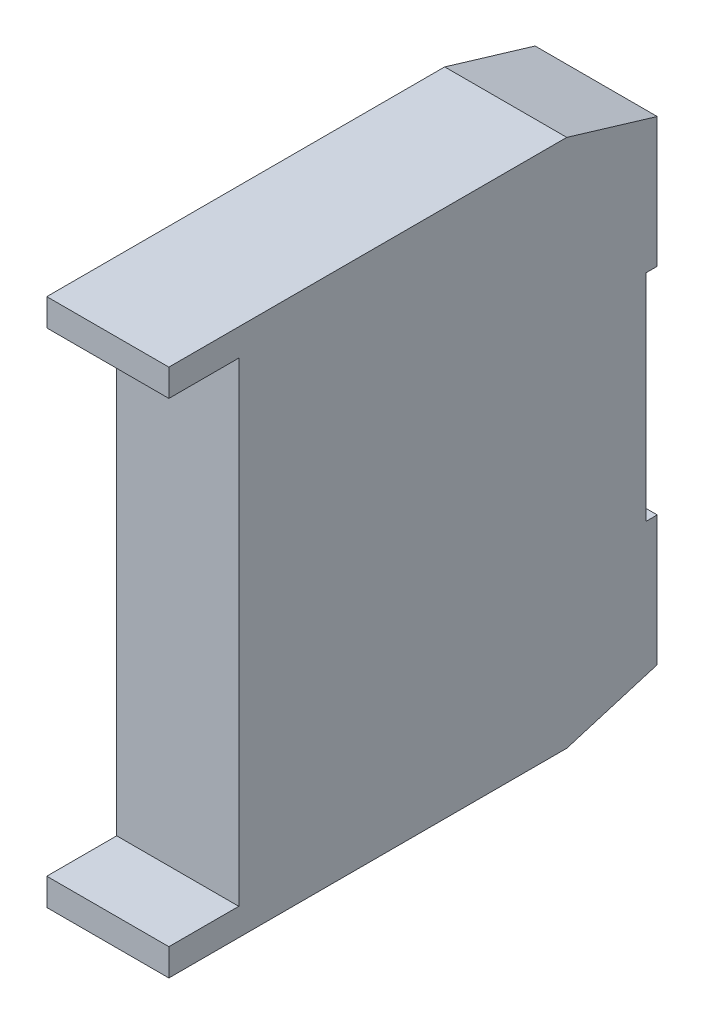
ISO-10303-21;
HEADER;
FILE_DESCRIPTION(('STEP AP214'),'2;1');
FILE_NAME('part.step','',(''),(''),'','','');
FILE_SCHEMA(('AUTOMOTIVE_DESIGN { 1 0 10303 214 1 1 1 1 }'));
ENDSEC;
DATA;
#1=APPLICATION_CONTEXT('core data for automotive mechanical design processes');
#2=APPLICATION_PROTOCOL_DEFINITION('international standard','automotive_design',2000,#1);
#3=PRODUCT_CONTEXT('',#1,'mechanical');
#4=PRODUCT('Part','Part','',(#3));
#5=PRODUCT_RELATED_PRODUCT_CATEGORY('part','',(#4));
#6=PRODUCT_DEFINITION_FORMATION('','',#4);
#7=PRODUCT_DEFINITION_CONTEXT('part definition',#1,'design');
#8=PRODUCT_DEFINITION('design','',#6,#7);
#9=PRODUCT_DEFINITION_SHAPE('','',#8);
#10=(LENGTH_UNIT() NAMED_UNIT(*) SI_UNIT(.MILLI.,.METRE.));
#11=(NAMED_UNIT(*) PLANE_ANGLE_UNIT() SI_UNIT($,.RADIAN.));
#12=(NAMED_UNIT(*) SI_UNIT($,.STERADIAN.) SOLID_ANGLE_UNIT());
#13=UNCERTAINTY_MEASURE_WITH_UNIT(LENGTH_MEASURE(1.E-05),#10,'distance_accuracy_value','');
#14=(GEOMETRIC_REPRESENTATION_CONTEXT(3) GLOBAL_UNCERTAINTY_ASSIGNED_CONTEXT((#13)) GLOBAL_UNIT_ASSIGNED_CONTEXT((#10,
#11,#12)) REPRESENTATION_CONTEXT('',''));
#15=CARTESIAN_POINT('',(0.,0.,0.));
#16=DIRECTION('',(0.,0.,1.));
#17=DIRECTION('',(1.,0.,0.));
#18=AXIS2_PLACEMENT_3D('',#15,#16,#17);
#19=CARTESIAN_POINT('',(-4.5,17.5,0.));
#20=DIRECTION('',(0.,-1.,0.));
#21=DIRECTION('',(0.,0.,-1.));
#22=AXIS2_PLACEMENT_3D('',#19,#20,#21);
#23=PLANE('',#22);
#24=DIRECTION('',(1.,0.,0.));
#25=VECTOR('',#24,1.);
#26=CARTESIAN_POINT('',(-4.5,17.5,-5.15334352392346));
#27=LINE('',#26,#25);
#28=CARTESIAN_POINT('',(-4.5,17.5,-5.15334352392346));
#29=VERTEX_POINT('',#28);
#30=CARTESIAN_POINT('',(4.5,17.5,-5.15334352392346));
#31=VERTEX_POINT('',#30);
#32=EDGE_CURVE('E38',#29,#31,#27,.T.);
#33=ORIENTED_EDGE('',*,*,#32,.T.);
#34=DIRECTION('',(0.,0.,-1.));
#35=VECTOR('',#34,1.);
#36=CARTESIAN_POINT('',(4.5,17.5,0.));
#37=LINE('',#36,#35);
#38=CARTESIAN_POINT('',(4.5,17.5,0.));
#39=VERTEX_POINT('',#38);
#40=EDGE_CURVE('E135',#39,#31,#37,.T.);
#41=ORIENTED_EDGE('',*,*,#40,.F.);
#42=DIRECTION('',(1.,0.,0.));
#43=VECTOR('',#42,1.);
#44=CARTESIAN_POINT('',(-4.5,17.5,0.));
#45=LINE('',#44,#43);
#46=CARTESIAN_POINT('',(-4.5,17.5,0.));
#47=VERTEX_POINT('',#46);
#48=EDGE_CURVE('E11',#47,#39,#45,.T.);
#49=ORIENTED_EDGE('',*,*,#48,.F.);
#50=DIRECTION('',(0.,0.,-1.));
#51=VECTOR('',#50,1.);
#52=CARTESIAN_POINT('',(-4.5,17.5,0.));
#53=LINE('',#52,#51);
#54=EDGE_CURVE('E136',#47,#29,#53,.T.);
#55=ORIENTED_EDGE('',*,*,#54,.T.);
#56=EDGE_LOOP('',(#33,#41,#49,#55));
#57=FACE_BOUND('',#56,.T.);
#58=ADVANCED_FACE('F35',(#57),#23,.T.);
#59=CARTESIAN_POINT('',(-4.5,17.5,0.));
#60=DIRECTION('',(0.,0.,1.));
#61=DIRECTION('',(0.,-1.,0.));
#62=AXIS2_PLACEMENT_3D('',#59,#60,#61);
#63=PLANE('',#62);
#64=ORIENTED_EDGE('',*,*,#48,.T.);
#65=DIRECTION('',(0.,-1.,0.));
#66=VECTOR('',#65,1.);
#67=CARTESIAN_POINT('',(4.5,17.5,0.));
#68=LINE('',#67,#66);
#69=CARTESIAN_POINT('',(4.5,19.5,0.));
#70=VERTEX_POINT('',#69);
#71=EDGE_CURVE('E153',#70,#39,#68,.T.);
#72=ORIENTED_EDGE('',*,*,#71,.F.);
#73=DIRECTION('',(1.,0.,0.));
#74=VECTOR('',#73,1.);
#75=CARTESIAN_POINT('',(-4.5,19.5,0.));
#76=LINE('',#75,#74);
#77=CARTESIAN_POINT('',(-4.5,19.5,0.));
#78=VERTEX_POINT('',#77);
#79=EDGE_CURVE('E43',#78,#70,#76,.T.);
#80=ORIENTED_EDGE('',*,*,#79,.F.);
#81=DIRECTION('',(0.,-1.,0.));
#82=VECTOR('',#81,1.);
#83=CARTESIAN_POINT('',(-4.5,17.5,0.));
#84=LINE('',#83,#82);
#85=EDGE_CURVE('E141',#78,#47,#84,.T.);
#86=ORIENTED_EDGE('',*,*,#85,.T.);
#87=EDGE_LOOP('',(#64,#72,#80,#86));
#88=FACE_BOUND('',#87,.T.);
#89=ADVANCED_FACE('F289',(#88),#63,.T.);
#90=CARTESIAN_POINT('',(-4.5,19.5,0.));
#91=DIRECTION('',(0.,1.,0.));
#92=DIRECTION('',(0.,0.,1.));
#93=AXIS2_PLACEMENT_3D('',#90,#91,#92);
#94=PLANE('',#93);
#95=ORIENTED_EDGE('',*,*,#79,.T.);
#96=DIRECTION('',(0.,0.,1.));
#97=VECTOR('',#96,1.);
#98=CARTESIAN_POINT('',(4.5,19.5,0.));
#99=LINE('',#98,#97);
#100=CARTESIAN_POINT('',(4.5,19.5,-29.3330418003506));
#101=VERTEX_POINT('',#100);
#102=EDGE_CURVE('E184',#101,#70,#99,.T.);
#103=ORIENTED_EDGE('',*,*,#102,.F.);
#104=DIRECTION('',(1.,0.,0.));
#105=VECTOR('',#104,1.);
#106=CARTESIAN_POINT('',(-4.5,19.5,-29.3330418003506));
#107=LINE('',#106,#105);
#108=CARTESIAN_POINT('',(-4.5,19.5,-29.3330418003506));
#109=VERTEX_POINT('',#108);
#110=EDGE_CURVE('E224',#109,#101,#107,.T.);
#111=ORIENTED_EDGE('',*,*,#110,.F.);
#112=DIRECTION('',(0.,0.,1.));
#113=VECTOR('',#112,1.);
#114=CARTESIAN_POINT('',(-4.5,19.5,0.));
#115=LINE('',#114,#113);
#116=EDGE_CURVE('E220',#109,#78,#115,.T.);
#117=ORIENTED_EDGE('',*,*,#116,.T.);
#118=EDGE_LOOP('',(#95,#103,#111,#117));
#119=FACE_BOUND('',#118,.T.);
#120=ADVANCED_FACE('F288',(#119),#94,.T.);
#121=CARTESIAN_POINT('',(-4.5,19.5,-29.3330418003506));
#122=DIRECTION('',(0.,0.957829743464759,-0.28733635783561));
#123=DIRECTION('',(0.,0.28733635783561,0.957829743464759));
#124=AXIS2_PLACEMENT_3D('',#121,#122,#123);
#125=PLANE('',#124);
#126=ORIENTED_EDGE('',*,*,#110,.T.);
#127=DIRECTION('',(0.,0.28733635783561,0.957829743464759));
#128=VECTOR('',#127,1.);
#129=CARTESIAN_POINT('',(4.5,19.5,-29.3330418003506));
#130=LINE('',#129,#128);
#131=CARTESIAN_POINT('',(4.5,17.5,-36.));
#132=VERTEX_POINT('',#131);
#133=EDGE_CURVE('E181',#132,#101,#130,.T.);
#134=ORIENTED_EDGE('',*,*,#133,.F.);
#135=DIRECTION('',(1.,0.,0.));
#136=VECTOR('',#135,1.);
#137=CARTESIAN_POINT('',(-4.5,17.5,-36.));
#138=LINE('',#137,#136);
#139=CARTESIAN_POINT('',(-4.5,17.5,-36.));
#140=VERTEX_POINT('',#139);
#141=EDGE_CURVE('E226',#140,#132,#138,.T.);
#142=ORIENTED_EDGE('',*,*,#141,.F.);
#143=DIRECTION('',(0.,0.28733635783561,0.957829743464759));
#144=VECTOR('',#143,1.);
#145=CARTESIAN_POINT('',(-4.5,19.5,-29.3330418003506));
#146=LINE('',#145,#144);
#147=EDGE_CURVE('E217',#140,#109,#146,.T.);
#148=ORIENTED_EDGE('',*,*,#147,.T.);
#149=EDGE_LOOP('',(#126,#134,#142,#148));
#150=FACE_BOUND('',#149,.T.);
#151=ADVANCED_FACE('F284',(#150),#125,.T.);
#152=CARTESIAN_POINT('',(-4.5,17.5,-36.));
#153=DIRECTION('',(0.,0.,-1.));
#154=DIRECTION('',(-1.,0.,0.));
#155=AXIS2_PLACEMENT_3D('',#152,#153,#154);
#156=PLANE('',#155);
#157=ORIENTED_EDGE('',*,*,#141,.T.);
#158=DIRECTION('',(0.,1.,0.));
#159=VECTOR('',#158,1.);
#160=CARTESIAN_POINT('',(4.5,17.5,-36.));
#161=LINE('',#160,#159);
#162=CARTESIAN_POINT('',(4.5,7.93406177536711,-36.));
#163=VERTEX_POINT('',#162);
#164=EDGE_CURVE('E178',#163,#132,#161,.T.);
#165=ORIENTED_EDGE('',*,*,#164,.F.);
#166=DIRECTION('',(1.,0.,0.));
#167=VECTOR('',#166,1.);
#168=CARTESIAN_POINT('',(-4.5,7.93406177536711,-36.));
#169=LINE('',#168,#167);
#170=CARTESIAN_POINT('',(-4.5,7.93406177536711,-36.));
#171=VERTEX_POINT('',#170);
#172=EDGE_CURVE('E228',#171,#163,#169,.T.);
#173=ORIENTED_EDGE('',*,*,#172,.F.);
#174=DIRECTION('',(0.,1.,0.));
#175=VECTOR('',#174,1.);
#176=CARTESIAN_POINT('',(-4.5,17.5,-36.));
#177=LINE('',#176,#175);
#178=EDGE_CURVE('E214',#171,#140,#177,.T.);
#179=ORIENTED_EDGE('',*,*,#178,.T.);
#180=EDGE_LOOP('',(#157,#165,#173,#179));
#181=FACE_BOUND('',#180,.T.);
#182=ADVANCED_FACE('F279',(#181),#156,.T.);
#183=CARTESIAN_POINT('',(-4.5,7.93406177536711,-36.));
#184=DIRECTION('',(0.,-1.,0.));
#185=DIRECTION('',(0.,0.,-1.));
#186=AXIS2_PLACEMENT_3D('',#183,#184,#185);
#187=PLANE('',#186);
#188=ORIENTED_EDGE('',*,*,#172,.T.);
#189=DIRECTION('',(0.,0.,-1.));
#190=VECTOR('',#189,1.);
#191=CARTESIAN_POINT('',(4.5,7.93406177536711,-36.));
#192=LINE('',#191,#190);
#193=CARTESIAN_POINT('',(4.5,7.93406177536711,-35.1809150074177));
#194=VERTEX_POINT('',#193);
#195=EDGE_CURVE('E175',#194,#163,#192,.T.);
#196=ORIENTED_EDGE('',*,*,#195,.F.);
#197=DIRECTION('',(1.,0.,0.));
#198=VECTOR('',#197,1.);
#199=CARTESIAN_POINT('',(-4.5,7.93406177536711,-35.1809150074177));
#200=LINE('',#199,#198);
#201=CARTESIAN_POINT('',(-4.5,7.93406177536711,-35.1809150074177));
#202=VERTEX_POINT('',#201);
#203=EDGE_CURVE('E230',#202,#194,#200,.T.);
#204=ORIENTED_EDGE('',*,*,#203,.F.);
#205=DIRECTION('',(0.,0.,-1.));
#206=VECTOR('',#205,1.);
#207=CARTESIAN_POINT('',(-4.5,7.93406177536711,-36.));
#208=LINE('',#207,#206);
#209=EDGE_CURVE('E211',#202,#171,#208,.T.);
#210=ORIENTED_EDGE('',*,*,#209,.T.);
#211=EDGE_LOOP('',(#188,#196,#204,#210));
#212=FACE_BOUND('',#211,.T.);
#213=ADVANCED_FACE('F277',(#212),#187,.T.);
#214=CARTESIAN_POINT('',(-4.5,7.93406177536711,-35.1809150074177));
#215=DIRECTION('',(0.,0.,-1.));
#216=DIRECTION('',(-1.,0.,0.));
#217=AXIS2_PLACEMENT_3D('',#214,#215,#216);
#218=PLANE('',#217);
#219=ORIENTED_EDGE('',*,*,#203,.T.);
#220=DIRECTION('',(0.,1.,0.));
#221=VECTOR('',#220,1.);
#222=CARTESIAN_POINT('',(4.5,7.93406177536711,-35.1809150074177));
#223=LINE('',#222,#221);
#224=CARTESIAN_POINT('',(4.5,-7.93406177536711,-35.1809150074177));
#225=VERTEX_POINT('',#224);
#226=EDGE_CURVE('E172',#225,#194,#223,.T.);
#227=ORIENTED_EDGE('',*,*,#226,.F.);
#228=DIRECTION('',(1.,0.,0.));
#229=VECTOR('',#228,1.);
#230=CARTESIAN_POINT('',(-4.5,-7.93406177536711,-35.1809150074177));
#231=LINE('',#230,#229);
#232=CARTESIAN_POINT('',(-4.5,-7.93406177536711,-35.1809150074177));
#233=VERTEX_POINT('',#232);
#234=EDGE_CURVE('E232',#233,#225,#231,.T.);
#235=ORIENTED_EDGE('',*,*,#234,.F.);
#236=DIRECTION('',(0.,1.,0.));
#237=VECTOR('',#236,1.);
#238=CARTESIAN_POINT('',(-4.5,7.93406177536711,-35.1809150074177));
#239=LINE('',#238,#237);
#240=EDGE_CURVE('E208',#233,#202,#239,.T.);
#241=ORIENTED_EDGE('',*,*,#240,.T.);
#242=EDGE_LOOP('',(#219,#227,#235,#241));
#243=FACE_BOUND('',#242,.T.);
#244=ADVANCED_FACE('F272',(#243),#218,.T.);
#245=CARTESIAN_POINT('',(-4.5,-7.93406177536711,-36.));
#246=DIRECTION('',(0.,1.,0.));
#247=DIRECTION('',(0.,0.,1.));
#248=AXIS2_PLACEMENT_3D('',#245,#246,#247);
#249=PLANE('',#248);
#250=ORIENTED_EDGE('',*,*,#234,.T.);
#251=DIRECTION('',(0.,0.,1.));
#252=VECTOR('',#251,1.);
#253=CARTESIAN_POINT('',(4.5,-7.93406177536711,-36.));
#254=LINE('',#253,#252);
#255=CARTESIAN_POINT('',(4.5,-7.93406177536711,-36.));
#256=VERTEX_POINT('',#255);
#257=EDGE_CURVE('E169',#256,#225,#254,.T.);
#258=ORIENTED_EDGE('',*,*,#257,.F.);
#259=DIRECTION('',(1.,0.,0.));
#260=VECTOR('',#259,1.);
#261=CARTESIAN_POINT('',(-4.5,-7.93406177536711,-36.));
#262=LINE('',#261,#260);
#263=CARTESIAN_POINT('',(-4.5,-7.93406177536711,-36.));
#264=VERTEX_POINT('',#263);
#265=EDGE_CURVE('E234',#264,#256,#262,.T.);
#266=ORIENTED_EDGE('',*,*,#265,.F.);
#267=DIRECTION('',(0.,0.,1.));
#268=VECTOR('',#267,1.);
#269=CARTESIAN_POINT('',(-4.5,-7.93406177536711,-36.));
#270=LINE('',#269,#268);
#271=EDGE_CURVE('E205',#264,#233,#270,.T.);
#272=ORIENTED_EDGE('',*,*,#271,.T.);
#273=EDGE_LOOP('',(#250,#258,#266,#272));
#274=FACE_BOUND('',#273,.T.);
#275=ADVANCED_FACE('F267',(#274),#249,.T.);
#276=CARTESIAN_POINT('',(-4.5,-17.5,-36.));
#277=DIRECTION('',(0.,0.,-1.));
#278=DIRECTION('',(-1.,0.,0.));
#279=AXIS2_PLACEMENT_3D('',#276,#277,#278);
#280=PLANE('',#279);
#281=ORIENTED_EDGE('',*,*,#265,.T.);
#282=DIRECTION('',(0.,1.,0.));
#283=VECTOR('',#282,1.);
#284=CARTESIAN_POINT('',(4.5,-17.5,-36.));
#285=LINE('',#284,#283);
#286=CARTESIAN_POINT('',(4.5,-17.5,-36.));
#287=VERTEX_POINT('',#286);
#288=EDGE_CURVE('E166',#287,#256,#285,.T.);
#289=ORIENTED_EDGE('',*,*,#288,.F.);
#290=DIRECTION('',(1.,0.,0.));
#291=VECTOR('',#290,1.);
#292=CARTESIAN_POINT('',(-4.5,-17.5,-36.));
#293=LINE('',#292,#291);
#294=CARTESIAN_POINT('',(-4.5,-17.5,-36.));
#295=VERTEX_POINT('',#294);
#296=EDGE_CURVE('E236',#295,#287,#293,.T.);
#297=ORIENTED_EDGE('',*,*,#296,.F.);
#298=DIRECTION('',(0.,1.,0.));
#299=VECTOR('',#298,1.);
#300=CARTESIAN_POINT('',(-4.5,-17.5,-36.));
#301=LINE('',#300,#299);
#302=EDGE_CURVE('E202',#295,#264,#301,.T.);
#303=ORIENTED_EDGE('',*,*,#302,.T.);
#304=EDGE_LOOP('',(#281,#289,#297,#303));
#305=FACE_BOUND('',#304,.T.);
#306=ADVANCED_FACE('F265',(#305),#280,.T.);
#307=CARTESIAN_POINT('',(-4.5,-19.5,-29.3330418003506));
#308=DIRECTION('',(0.,-0.957829743464759,-0.28733635783561));
#309=DIRECTION('',(0.,0.28733635783561,-0.957829743464759));
#310=AXIS2_PLACEMENT_3D('',#307,#308,#309);
#311=PLANE('',#310);
#312=ORIENTED_EDGE('',*,*,#296,.T.);
#313=DIRECTION('',(0.,0.28733635783561,-0.957829743464759));
#314=VECTOR('',#313,1.);
#315=CARTESIAN_POINT('',(4.5,-19.5,-29.3330418003506));
#316=LINE('',#315,#314);
#317=CARTESIAN_POINT('',(4.5,-19.5,-29.3330418003506));
#318=VERTEX_POINT('',#317);
#319=EDGE_CURVE('E163',#318,#287,#316,.T.);
#320=ORIENTED_EDGE('',*,*,#319,.F.);
#321=DIRECTION('',(1.,0.,0.));
#322=VECTOR('',#321,1.);
#323=CARTESIAN_POINT('',(-4.5,-19.5,-29.3330418003506));
#324=LINE('',#323,#322);
#325=CARTESIAN_POINT('',(-4.5,-19.5,-29.3330418003506));
#326=VERTEX_POINT('',#325);
#327=EDGE_CURVE('E238',#326,#318,#324,.T.);
#328=ORIENTED_EDGE('',*,*,#327,.F.);
#329=DIRECTION('',(0.,0.28733635783561,-0.957829743464759));
#330=VECTOR('',#329,1.);
#331=CARTESIAN_POINT('',(-4.5,-19.5,-29.3330418003506));
#332=LINE('',#331,#330);
#333=EDGE_CURVE('E199',#326,#295,#332,.T.);
#334=ORIENTED_EDGE('',*,*,#333,.T.);
#335=EDGE_LOOP('',(#312,#320,#328,#334));
#336=FACE_BOUND('',#335,.T.);
#337=ADVANCED_FACE('F260',(#336),#311,.T.);
#338=CARTESIAN_POINT('',(-4.5,-19.5,0.));
#339=DIRECTION('',(0.,-1.,0.));
#340=DIRECTION('',(0.,0.,-1.));
#341=AXIS2_PLACEMENT_3D('',#338,#339,#340);
#342=PLANE('',#341);
#343=ORIENTED_EDGE('',*,*,#327,.T.);
#344=DIRECTION('',(0.,0.,-1.));
#345=VECTOR('',#344,1.);
#346=CARTESIAN_POINT('',(4.5,-19.5,0.));
#347=LINE('',#346,#345);
#348=CARTESIAN_POINT('',(4.5,-19.5,0.));
#349=VERTEX_POINT('',#348);
#350=EDGE_CURVE('E160',#349,#318,#347,.T.);
#351=ORIENTED_EDGE('',*,*,#350,.F.);
#352=DIRECTION('',(1.,0.,0.));
#353=VECTOR('',#352,1.);
#354=CARTESIAN_POINT('',(-4.5,-19.5,0.));
#355=LINE('',#354,#353);
#356=CARTESIAN_POINT('',(-4.5,-19.5,0.));
#357=VERTEX_POINT('',#356);
#358=EDGE_CURVE('E240',#357,#349,#355,.T.);
#359=ORIENTED_EDGE('',*,*,#358,.F.);
#360=DIRECTION('',(0.,0.,-1.));
#361=VECTOR('',#360,1.);
#362=CARTESIAN_POINT('',(-4.5,-19.5,0.));
#363=LINE('',#362,#361);
#364=EDGE_CURVE('E196',#357,#326,#363,.T.);
#365=ORIENTED_EDGE('',*,*,#364,.T.);
#366=EDGE_LOOP('',(#343,#351,#359,#365));
#367=FACE_BOUND('',#366,.T.);
#368=ADVANCED_FACE('F253',(#367),#342,.T.);
#369=CARTESIAN_POINT('',(-4.5,-17.5,1.02397635700565E-13));
#370=DIRECTION('',(0.,0.,1.));
#371=DIRECTION('',(0.,-1.,0.));
#372=AXIS2_PLACEMENT_3D('',#369,#370,#371);
#373=PLANE('',#372);
#374=ORIENTED_EDGE('',*,*,#358,.T.);
#375=DIRECTION('',(0.,-1.,0.));
#376=VECTOR('',#375,1.);
#377=CARTESIAN_POINT('',(4.5,-17.5,1.02397635700565E-13));
#378=LINE('',#377,#376);
#379=CARTESIAN_POINT('',(4.5,-17.5,1.02397635700565E-13));
#380=VERTEX_POINT('',#379);
#381=EDGE_CURVE('E157',#380,#349,#378,.T.);
#382=ORIENTED_EDGE('',*,*,#381,.F.);
#383=DIRECTION('',(1.,0.,0.));
#384=VECTOR('',#383,1.);
#385=CARTESIAN_POINT('',(-4.5,-17.5,1.02397635700565E-13));
#386=LINE('',#385,#384);
#387=CARTESIAN_POINT('',(-4.5,-17.5,1.02397635700565E-13));
#388=VERTEX_POINT('',#387);
#389=EDGE_CURVE('E242',#388,#380,#386,.T.);
#390=ORIENTED_EDGE('',*,*,#389,.F.);
#391=DIRECTION('',(0.,-1.,0.));
#392=VECTOR('',#391,1.);
#393=CARTESIAN_POINT('',(-4.5,-17.5,1.02397635700565E-13));
#394=LINE('',#393,#392);
#395=EDGE_CURVE('E193',#388,#357,#394,.T.);
#396=ORIENTED_EDGE('',*,*,#395,.T.);
#397=EDGE_LOOP('',(#374,#382,#390,#396));
#398=FACE_BOUND('',#397,.T.);
#399=ADVANCED_FACE('F250',(#398),#373,.T.);
#400=CARTESIAN_POINT('',(-4.5,-17.5,1.02397635700565E-13));
#401=DIRECTION('',(0.,1.,0.));
#402=DIRECTION('',(0.,0.,1.));
#403=AXIS2_PLACEMENT_3D('',#400,#401,#402);
#404=PLANE('',#403);
#405=ORIENTED_EDGE('',*,*,#389,.T.);
#406=DIRECTION('',(0.,0.,1.));
#407=VECTOR('',#406,1.);
#408=CARTESIAN_POINT('',(4.5,-17.5,1.02397635700565E-13));
#409=LINE('',#408,#407);
#410=CARTESIAN_POINT('',(4.5,-17.5,-5.15334352392335));
#411=VERTEX_POINT('',#410);
#412=EDGE_CURVE('E148',#411,#380,#409,.T.);
#413=ORIENTED_EDGE('',*,*,#412,.F.);
#414=DIRECTION('',(1.,0.,0.));
#415=VECTOR('',#414,1.);
#416=CARTESIAN_POINT('',(-4.5,-17.5,-5.15334352392335));
#417=LINE('',#416,#415);
#418=CARTESIAN_POINT('',(-4.5,-17.5,-5.15334352392335));
#419=VERTEX_POINT('',#418);
#420=EDGE_CURVE('E140',#419,#411,#417,.T.);
#421=ORIENTED_EDGE('',*,*,#420,.F.);
#422=DIRECTION('',(0.,0.,1.));
#423=VECTOR('',#422,1.);
#424=CARTESIAN_POINT('',(-4.5,-17.5,1.02397635700565E-13));
#425=LINE('',#424,#423);
#426=EDGE_CURVE('E190',#419,#388,#425,.T.);
#427=ORIENTED_EDGE('',*,*,#426,.T.);
#428=EDGE_LOOP('',(#405,#413,#421,#427));
#429=FACE_BOUND('',#428,.T.);
#430=ADVANCED_FACE('F244',(#429),#404,.T.);
#431=CARTESIAN_POINT('',(-4.5,17.5,-5.15334352392346));
#432=DIRECTION('',(0.,0.,1.));
#433=DIRECTION('',(0.,-1.,0.));
#434=AXIS2_PLACEMENT_3D('',#431,#432,#433);
#435=PLANE('',#434);
#436=ORIENTED_EDGE('',*,*,#420,.T.);
#437=DIRECTION('',(0.,-1.,0.));
#438=VECTOR('',#437,1.);
#439=CARTESIAN_POINT('',(4.5,17.5,-5.15334352392346));
#440=LINE('',#439,#438);
#441=EDGE_CURVE('E143',#31,#411,#440,.T.);
#442=ORIENTED_EDGE('',*,*,#441,.F.);
#443=ORIENTED_EDGE('',*,*,#32,.F.);
#444=DIRECTION('',(0.,-1.,0.));
#445=VECTOR('',#444,1.);
#446=CARTESIAN_POINT('',(-4.5,17.5,-5.15334352392346));
#447=LINE('',#446,#445);
#448=EDGE_CURVE('E188',#29,#419,#447,.T.);
#449=ORIENTED_EDGE('',*,*,#448,.T.);
#450=EDGE_LOOP('',(#436,#442,#443,#449));
#451=FACE_BOUND('',#450,.T.);
#452=ADVANCED_FACE('F144',(#451),#435,.T.);
#453=CARTESIAN_POINT('',(-4.5,0.,0.));
#454=DIRECTION('',(-1.,0.,0.));
#455=DIRECTION('',(0.,0.,1.));
#456=AXIS2_PLACEMENT_3D('',#453,#454,#455);
#457=PLANE('',#456);
#458=ORIENTED_EDGE('',*,*,#54,.F.);
#459=ORIENTED_EDGE('',*,*,#85,.F.);
#460=ORIENTED_EDGE('',*,*,#116,.F.);
#461=ORIENTED_EDGE('',*,*,#147,.F.);
#462=ORIENTED_EDGE('',*,*,#178,.F.);
#463=ORIENTED_EDGE('',*,*,#209,.F.);
#464=ORIENTED_EDGE('',*,*,#240,.F.);
#465=ORIENTED_EDGE('',*,*,#271,.F.);
#466=ORIENTED_EDGE('',*,*,#302,.F.);
#467=ORIENTED_EDGE('',*,*,#333,.F.);
#468=ORIENTED_EDGE('',*,*,#364,.F.);
#469=ORIENTED_EDGE('',*,*,#395,.F.);
#470=ORIENTED_EDGE('',*,*,#426,.F.);
#471=ORIENTED_EDGE('',*,*,#448,.F.);
#472=EDGE_LOOP('',(#458,#459,#460,#461,#462,#463,#464,#465,#466,#467,#468,#469,#470,#471));
#473=FACE_BOUND('',#472,.T.);
#474=ADVANCED_FACE('F256',(#473),#457,.T.);
#475=CARTESIAN_POINT('',(4.5,0.,0.));
#476=DIRECTION('',(-1.,0.,0.));
#477=DIRECTION('',(0.,0.,1.));
#478=AXIS2_PLACEMENT_3D('',#475,#476,#477);
#479=PLANE('',#478);
#480=ORIENTED_EDGE('',*,*,#40,.T.);
#481=ORIENTED_EDGE('',*,*,#441,.T.);
#482=ORIENTED_EDGE('',*,*,#412,.T.);
#483=ORIENTED_EDGE('',*,*,#381,.T.);
#484=ORIENTED_EDGE('',*,*,#350,.T.);
#485=ORIENTED_EDGE('',*,*,#319,.T.);
#486=ORIENTED_EDGE('',*,*,#288,.T.);
#487=ORIENTED_EDGE('',*,*,#257,.T.);
#488=ORIENTED_EDGE('',*,*,#226,.T.);
#489=ORIENTED_EDGE('',*,*,#195,.T.);
#490=ORIENTED_EDGE('',*,*,#164,.T.);
#491=ORIENTED_EDGE('',*,*,#133,.T.);
#492=ORIENTED_EDGE('',*,*,#102,.T.);
#493=ORIENTED_EDGE('',*,*,#71,.T.);
#494=EDGE_LOOP('',(#480,#481,#482,#483,#484,#485,#486,#487,#488,#489,#490,#491,#492,#493));
#495=FACE_BOUND('',#494,.T.);
#496=ADVANCED_FACE('F151',(#495),#479,.F.);
#497=CLOSED_SHELL('',(#58,#89,#120,#151,#182,#213,#244,#275,#306,#337,#368,#399,#430,#452,#474,#496));
#498=MANIFOLD_SOLID_BREP('B2',#497);
#499=ADVANCED_BREP_SHAPE_REPRESENTATION('',(#18,#498),#14);
#500=SHAPE_DEFINITION_REPRESENTATION(#9,#499);
ENDSEC;
END-ISO-10303-21;
